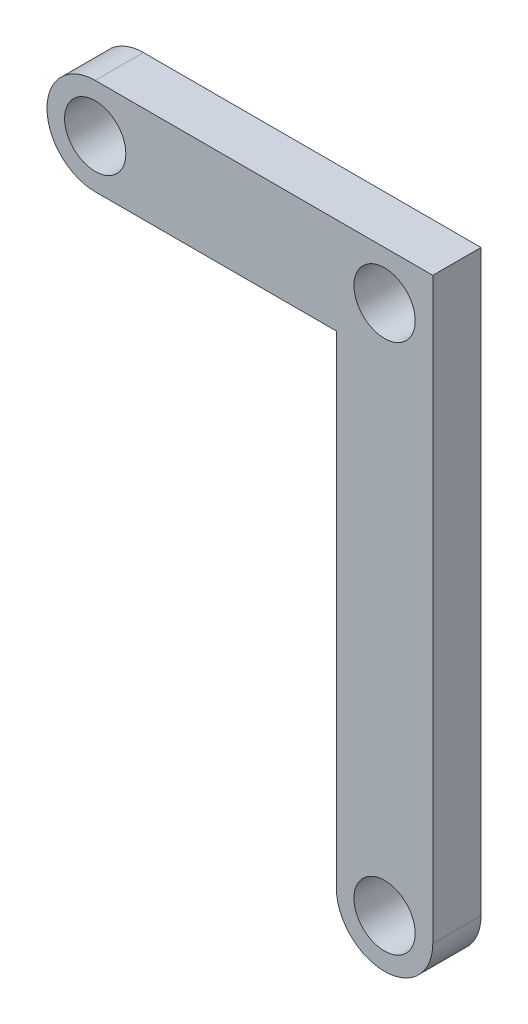
ISO-10303-21;
HEADER;
FILE_DESCRIPTION(('STEP AP214'),'2;1');
FILE_NAME('part.step','',(''),(''),'','','');
FILE_SCHEMA(('AUTOMOTIVE_DESIGN { 1 0 10303 214 1 1 1 1 }'));
ENDSEC;
DATA;
#1=APPLICATION_CONTEXT('core data for automotive mechanical design processes');
#2=APPLICATION_PROTOCOL_DEFINITION('international standard','automotive_design',2000,#1);
#3=PRODUCT_CONTEXT('',#1,'mechanical');
#4=PRODUCT('Part','Part','',(#3));
#5=PRODUCT_RELATED_PRODUCT_CATEGORY('part','',(#4));
#6=PRODUCT_DEFINITION_FORMATION('','',#4);
#7=PRODUCT_DEFINITION_CONTEXT('part definition',#1,'design');
#8=PRODUCT_DEFINITION('design','',#6,#7);
#9=PRODUCT_DEFINITION_SHAPE('','',#8);
#10=(LENGTH_UNIT() NAMED_UNIT(*) SI_UNIT(.MILLI.,.METRE.));
#11=(NAMED_UNIT(*) PLANE_ANGLE_UNIT() SI_UNIT($,.RADIAN.));
#12=(NAMED_UNIT(*) SI_UNIT($,.STERADIAN.) SOLID_ANGLE_UNIT());
#13=UNCERTAINTY_MEASURE_WITH_UNIT(LENGTH_MEASURE(1.E-05),#10,'distance_accuracy_value','');
#14=(GEOMETRIC_REPRESENTATION_CONTEXT(3) GLOBAL_UNCERTAINTY_ASSIGNED_CONTEXT((#13)) GLOBAL_UNIT_ASSIGNED_CONTEXT((#10,
#11,#12)) REPRESENTATION_CONTEXT('',''));
#15=CARTESIAN_POINT('',(0.,0.,0.));
#16=DIRECTION('',(0.,0.,1.));
#17=DIRECTION('',(1.,0.,0.));
#18=AXIS2_PLACEMENT_3D('',#15,#16,#17);
#19=CARTESIAN_POINT('',(-25.,5.,2.5));
#20=DIRECTION('',(0.,0.,-1.));
#21=DIRECTION('',(-1.,0.,0.));
#22=AXIS2_PLACEMENT_3D('',#19,#20,#21);
#23=PLANE('',#22);
#24=DIRECTION('',(1.,0.,0.));
#25=VECTOR('',#24,1.);
#26=CARTESIAN_POINT('',(0.,0.,2.5));
#27=LINE('',#26,#25);
#28=CARTESIAN_POINT('',(-25.,0.,2.5));
#29=VERTEX_POINT('',#28);
#30=CARTESIAN_POINT('',(0.,0.,2.5));
#31=VERTEX_POINT('',#30);
#32=EDGE_CURVE('E135',#29,#31,#27,.T.);
#33=ORIENTED_EDGE('',*,*,#32,.T.);
#34=DIRECTION('',(0.,-1.,0.));
#35=VECTOR('',#34,1.);
#36=CARTESIAN_POINT('',(0.,0.,2.5));
#37=LINE('',#36,#35);
#38=CARTESIAN_POINT('',(0.,-50.,2.5));
#39=VERTEX_POINT('',#38);
#40=EDGE_CURVE('E93',#31,#39,#37,.T.);
#41=ORIENTED_EDGE('',*,*,#40,.T.);
#42=CARTESIAN_POINT('',(5.00000000000001,-50.,2.5));
#43=DIRECTION('',(0.,0.,1.));
#44=DIRECTION('',(1.,0.,0.));
#45=AXIS2_PLACEMENT_3D('',#42,#43,#44);
#46=CIRCLE('',#45,5.);
#47=CARTESIAN_POINT('',(10.,-50.,2.5));
#48=VERTEX_POINT('',#47);
#49=EDGE_CURVE('E106',#39,#48,#46,.T.);
#50=ORIENTED_EDGE('',*,*,#49,.T.);
#51=DIRECTION('',(0.,1.,0.));
#52=VECTOR('',#51,1.);
#53=CARTESIAN_POINT('',(10.,10.,2.5));
#54=LINE('',#53,#52);
#55=CARTESIAN_POINT('',(10.,10.,2.5));
#56=VERTEX_POINT('',#55);
#57=EDGE_CURVE('E100',#48,#56,#54,.T.);
#58=ORIENTED_EDGE('',*,*,#57,.T.);
#59=DIRECTION('',(-1.,0.,0.));
#60=VECTOR('',#59,1.);
#61=CARTESIAN_POINT('',(10.,10.,2.5));
#62=LINE('',#61,#60);
#63=CARTESIAN_POINT('',(-25.,10.,2.5));
#64=VERTEX_POINT('',#63);
#65=EDGE_CURVE('E104',#56,#64,#62,.T.);
#66=ORIENTED_EDGE('',*,*,#65,.T.);
#67=CARTESIAN_POINT('',(-25.,5.,2.5));
#68=DIRECTION('',(0.,0.,1.));
#69=DIRECTION('',(-1.,0.,0.));
#70=AXIS2_PLACEMENT_3D('',#67,#68,#69);
#71=CIRCLE('',#70,5.);
#72=EDGE_CURVE('E56',#64,#29,#71,.T.);
#73=ORIENTED_EDGE('',*,*,#72,.T.);
#74=EDGE_LOOP('',(#33,#41,#50,#58,#66,#73));
#75=FACE_BOUND('',#74,.T.);
#76=CARTESIAN_POINT('',(5.00000000000001,-50.,2.5));
#77=DIRECTION('',(0.,0.,1.));
#78=DIRECTION('',(1.,0.,0.));
#79=AXIS2_PLACEMENT_3D('',#76,#77,#78);
#80=CIRCLE('',#79,3.175);
#81=CARTESIAN_POINT('',(8.17500000000001,-50.,2.5));
#82=VERTEX_POINT('',#81);
#83=EDGE_CURVE('E128',#82,#82,#80,.T.);
#84=ORIENTED_EDGE('',*,*,#83,.F.);
#85=EDGE_LOOP('',(#84));
#86=FACE_BOUND('',#85,.T.);
#87=CARTESIAN_POINT('',(5.,5.,2.5));
#88=DIRECTION('',(0.,0.,1.));
#89=DIRECTION('',(1.,0.,0.));
#90=AXIS2_PLACEMENT_3D('',#87,#88,#89);
#91=CIRCLE('',#90,3.175);
#92=CARTESIAN_POINT('',(8.17500000000001,5.,2.5));
#93=VERTEX_POINT('',#92);
#94=EDGE_CURVE('E189',#93,#93,#91,.T.);
#95=ORIENTED_EDGE('',*,*,#94,.F.);
#96=EDGE_LOOP('',(#95));
#97=FACE_BOUND('',#96,.T.);
#98=CARTESIAN_POINT('',(-25.,5.,2.5));
#99=DIRECTION('',(0.,0.,1.));
#100=DIRECTION('',(1.,0.,0.));
#101=AXIS2_PLACEMENT_3D('',#98,#99,#100);
#102=CIRCLE('',#101,3.175);
#103=CARTESIAN_POINT('',(-21.825,5.,2.5));
#104=VERTEX_POINT('',#103);
#105=EDGE_CURVE('E180',#104,#104,#102,.T.);
#106=ORIENTED_EDGE('',*,*,#105,.F.);
#107=EDGE_LOOP('',(#106));
#108=FACE_BOUND('',#107,.T.);
#109=ADVANCED_FACE('F39',(#75,#86,#97,#108),#23,.F.);
#110=CARTESIAN_POINT('',(-25.,5.,-2.5));
#111=DIRECTION('',(0.,0.,-1.));
#112=DIRECTION('',(-1.,0.,0.));
#113=AXIS2_PLACEMENT_3D('',#110,#111,#112);
#114=PLANE('',#113);
#115=CARTESIAN_POINT('',(5.,5.,-2.5));
#116=DIRECTION('',(0.,0.,1.));
#117=DIRECTION('',(1.,0.,0.));
#118=AXIS2_PLACEMENT_3D('',#115,#116,#117);
#119=CIRCLE('',#118,3.175);
#120=CARTESIAN_POINT('',(8.17500000000001,5.,-2.5));
#121=VERTEX_POINT('',#120);
#122=EDGE_CURVE('E186',#121,#121,#119,.T.);
#123=ORIENTED_EDGE('',*,*,#122,.T.);
#124=EDGE_LOOP('',(#123));
#125=FACE_BOUND('',#124,.T.);
#126=DIRECTION('',(1.,0.,0.));
#127=VECTOR('',#126,1.);
#128=CARTESIAN_POINT('',(0.,0.,-2.5));
#129=LINE('',#128,#127);
#130=CARTESIAN_POINT('',(-25.,0.,-2.5));
#131=VERTEX_POINT('',#130);
#132=CARTESIAN_POINT('',(0.,0.,-2.5));
#133=VERTEX_POINT('',#132);
#134=EDGE_CURVE('E124',#131,#133,#129,.T.);
#135=ORIENTED_EDGE('',*,*,#134,.F.);
#136=CARTESIAN_POINT('',(-25.,5.,-2.5));
#137=DIRECTION('',(0.,0.,1.));
#138=DIRECTION('',(-1.,0.,0.));
#139=AXIS2_PLACEMENT_3D('',#136,#137,#138);
#140=CIRCLE('',#139,5.);
#141=CARTESIAN_POINT('',(-25.,10.,-2.5));
#142=VERTEX_POINT('',#141);
#143=EDGE_CURVE('E85',#142,#131,#140,.T.);
#144=ORIENTED_EDGE('',*,*,#143,.F.);
#145=DIRECTION('',(-1.,0.,0.));
#146=VECTOR('',#145,1.);
#147=CARTESIAN_POINT('',(10.,10.,-2.5));
#148=LINE('',#147,#146);
#149=CARTESIAN_POINT('',(10.,10.,-2.5));
#150=VERTEX_POINT('',#149);
#151=EDGE_CURVE('E79',#150,#142,#148,.T.);
#152=ORIENTED_EDGE('',*,*,#151,.F.);
#153=DIRECTION('',(0.,1.,0.));
#154=VECTOR('',#153,1.);
#155=CARTESIAN_POINT('',(10.,10.,-2.5));
#156=LINE('',#155,#154);
#157=CARTESIAN_POINT('',(10.,-50.,-2.5));
#158=VERTEX_POINT('',#157);
#159=EDGE_CURVE('E114',#158,#150,#156,.T.);
#160=ORIENTED_EDGE('',*,*,#159,.F.);
#161=CARTESIAN_POINT('',(5.00000000000001,-50.,-2.5));
#162=DIRECTION('',(0.,0.,1.));
#163=DIRECTION('',(1.,0.,0.));
#164=AXIS2_PLACEMENT_3D('',#161,#162,#163);
#165=CIRCLE('',#164,5.);
#166=CARTESIAN_POINT('',(0.,-50.,-2.5));
#167=VERTEX_POINT('',#166);
#168=EDGE_CURVE('E130',#167,#158,#165,.T.);
#169=ORIENTED_EDGE('',*,*,#168,.F.);
#170=DIRECTION('',(0.,-1.,0.));
#171=VECTOR('',#170,1.);
#172=CARTESIAN_POINT('',(0.,0.,-2.5));
#173=LINE('',#172,#171);
#174=EDGE_CURVE('E127',#133,#167,#173,.T.);
#175=ORIENTED_EDGE('',*,*,#174,.F.);
#176=EDGE_LOOP('',(#135,#144,#152,#160,#169,#175));
#177=FACE_BOUND('',#176,.T.);
#178=CARTESIAN_POINT('',(5.00000000000001,-50.,-2.5));
#179=DIRECTION('',(0.,0.,1.));
#180=DIRECTION('',(1.,0.,0.));
#181=AXIS2_PLACEMENT_3D('',#178,#179,#180);
#182=CIRCLE('',#181,3.175);
#183=CARTESIAN_POINT('',(8.17500000000001,-50.,-2.5));
#184=VERTEX_POINT('',#183);
#185=EDGE_CURVE('E192',#184,#184,#182,.T.);
#186=ORIENTED_EDGE('',*,*,#185,.T.);
#187=EDGE_LOOP('',(#186));
#188=FACE_BOUND('',#187,.T.);
#189=CARTESIAN_POINT('',(-25.,5.,-2.5));
#190=DIRECTION('',(0.,0.,1.));
#191=DIRECTION('',(1.,0.,0.));
#192=AXIS2_PLACEMENT_3D('',#189,#190,#191);
#193=CIRCLE('',#192,3.175);
#194=CARTESIAN_POINT('',(-21.825,5.,-2.5));
#195=VERTEX_POINT('',#194);
#196=EDGE_CURVE('E183',#195,#195,#193,.T.);
#197=ORIENTED_EDGE('',*,*,#196,.T.);
#198=EDGE_LOOP('',(#197));
#199=FACE_BOUND('',#198,.T.);
#200=ADVANCED_FACE('F144',(#125,#177,#188,#199),#114,.T.);
#201=CARTESIAN_POINT('',(0.,0.,2.5));
#202=DIRECTION('',(0.,1.,0.));
#203=DIRECTION('',(-1.,0.,0.));
#204=AXIS2_PLACEMENT_3D('',#201,#202,#203);
#205=PLANE('',#204);
#206=ORIENTED_EDGE('',*,*,#134,.T.);
#207=DIRECTION('',(0.,0.,-1.));
#208=VECTOR('',#207,1.);
#209=CARTESIAN_POINT('',(0.,0.,2.5));
#210=LINE('',#209,#208);
#211=EDGE_CURVE('E11',#31,#133,#210,.T.);
#212=ORIENTED_EDGE('',*,*,#211,.F.);
#213=ORIENTED_EDGE('',*,*,#32,.F.);
#214=DIRECTION('',(0.,0.,-1.));
#215=VECTOR('',#214,1.);
#216=CARTESIAN_POINT('',(-25.,0.,2.5));
#217=LINE('',#216,#215);
#218=EDGE_CURVE('E120',#29,#131,#217,.T.);
#219=ORIENTED_EDGE('',*,*,#218,.T.);
#220=EDGE_LOOP('',(#206,#212,#213,#219));
#221=FACE_BOUND('',#220,.T.);
#222=ADVANCED_FACE('F41',(#221),#205,.F.);
#223=CARTESIAN_POINT('',(0.,0.,2.5));
#224=DIRECTION('',(1.,0.,0.));
#225=DIRECTION('',(0.,1.,0.));
#226=AXIS2_PLACEMENT_3D('',#223,#224,#225);
#227=PLANE('',#226);
#228=ORIENTED_EDGE('',*,*,#174,.T.);
#229=DIRECTION('',(0.,0.,-1.));
#230=VECTOR('',#229,1.);
#231=CARTESIAN_POINT('',(0.,-50.,2.5));
#232=LINE('',#231,#230);
#233=EDGE_CURVE('E48',#39,#167,#232,.T.);
#234=ORIENTED_EDGE('',*,*,#233,.F.);
#235=ORIENTED_EDGE('',*,*,#40,.F.);
#236=ORIENTED_EDGE('',*,*,#211,.T.);
#237=EDGE_LOOP('',(#228,#234,#235,#236));
#238=FACE_BOUND('',#237,.T.);
#239=ADVANCED_FACE('F247',(#238),#227,.F.);
#240=CARTESIAN_POINT('',(5.00000000000001,-50.,2.5));
#241=DIRECTION('',(0.,0.,-1.));
#242=DIRECTION('',(-1.,0.,0.));
#243=AXIS2_PLACEMENT_3D('',#240,#241,#242);
#244=CYLINDRICAL_SURFACE('',#243,5.);
#245=ORIENTED_EDGE('',*,*,#168,.T.);
#246=DIRECTION('',(0.,0.,-1.));
#247=VECTOR('',#246,1.);
#248=CARTESIAN_POINT('',(10.,-50.,2.5));
#249=LINE('',#248,#247);
#250=EDGE_CURVE('E115',#48,#158,#249,.T.);
#251=ORIENTED_EDGE('',*,*,#250,.F.);
#252=ORIENTED_EDGE('',*,*,#49,.F.);
#253=ORIENTED_EDGE('',*,*,#233,.T.);
#254=EDGE_LOOP('',(#245,#251,#252,#253));
#255=FACE_BOUND('',#254,.T.);
#256=ADVANCED_FACE('F141',(#255),#244,.T.);
#257=CARTESIAN_POINT('',(10.,10.,2.5));
#258=DIRECTION('',(-1.,0.,0.));
#259=DIRECTION('',(0.,-1.,0.));
#260=AXIS2_PLACEMENT_3D('',#257,#258,#259);
#261=PLANE('',#260);
#262=ORIENTED_EDGE('',*,*,#159,.T.);
#263=DIRECTION('',(0.,0.,-1.));
#264=VECTOR('',#263,1.);
#265=CARTESIAN_POINT('',(10.,10.,2.5));
#266=LINE('',#265,#264);
#267=EDGE_CURVE('E111',#56,#150,#266,.T.);
#268=ORIENTED_EDGE('',*,*,#267,.F.);
#269=ORIENTED_EDGE('',*,*,#57,.F.);
#270=ORIENTED_EDGE('',*,*,#250,.T.);
#271=EDGE_LOOP('',(#262,#268,#269,#270));
#272=FACE_BOUND('',#271,.T.);
#273=ADVANCED_FACE('F112',(#272),#261,.F.);
#274=CARTESIAN_POINT('',(10.,10.,2.5));
#275=DIRECTION('',(0.,-1.,0.));
#276=DIRECTION('',(1.,0.,0.));
#277=AXIS2_PLACEMENT_3D('',#274,#275,#276);
#278=PLANE('',#277);
#279=ORIENTED_EDGE('',*,*,#151,.T.);
#280=DIRECTION('',(0.,0.,-1.));
#281=VECTOR('',#280,1.);
#282=CARTESIAN_POINT('',(-25.,10.,2.5));
#283=LINE('',#282,#281);
#284=EDGE_CURVE('E116',#64,#142,#283,.T.);
#285=ORIENTED_EDGE('',*,*,#284,.F.);
#286=ORIENTED_EDGE('',*,*,#65,.F.);
#287=ORIENTED_EDGE('',*,*,#267,.T.);
#288=EDGE_LOOP('',(#279,#285,#286,#287));
#289=FACE_BOUND('',#288,.T.);
#290=ADVANCED_FACE('F118',(#289),#278,.F.);
#291=CARTESIAN_POINT('',(-25.,5.,2.5));
#292=DIRECTION('',(0.,0.,-1.));
#293=DIRECTION('',(-1.,0.,0.));
#294=AXIS2_PLACEMENT_3D('',#291,#292,#293);
#295=CYLINDRICAL_SURFACE('',#294,5.);
#296=ORIENTED_EDGE('',*,*,#143,.T.);
#297=ORIENTED_EDGE('',*,*,#218,.F.);
#298=ORIENTED_EDGE('',*,*,#72,.F.);
#299=ORIENTED_EDGE('',*,*,#284,.T.);
#300=EDGE_LOOP('',(#296,#297,#298,#299));
#301=FACE_BOUND('',#300,.T.);
#302=ADVANCED_FACE('F149',(#301),#295,.T.);
#303=CARTESIAN_POINT('',(5.00000000000001,-50.,2.5));
#304=DIRECTION('',(0.,0.,-1.));
#305=DIRECTION('',(-1.,0.,0.));
#306=AXIS2_PLACEMENT_3D('',#303,#304,#305);
#307=CYLINDRICAL_SURFACE('',#306,3.175);
#308=ORIENTED_EDGE('',*,*,#83,.T.);
#309=EDGE_LOOP('',(#308));
#310=FACE_BOUND('',#309,.T.);
#311=ORIENTED_EDGE('',*,*,#185,.F.);
#312=EDGE_LOOP('',(#311));
#313=FACE_BOUND('',#312,.T.);
#314=ADVANCED_FACE('F151',(#310,#313),#307,.F.);
#315=CARTESIAN_POINT('',(5.,5.,2.5));
#316=DIRECTION('',(0.,0.,-1.));
#317=DIRECTION('',(-1.,0.,0.));
#318=AXIS2_PLACEMENT_3D('',#315,#316,#317);
#319=CYLINDRICAL_SURFACE('',#318,3.175);
#320=ORIENTED_EDGE('',*,*,#94,.T.);
#321=EDGE_LOOP('',(#320));
#322=FACE_BOUND('',#321,.T.);
#323=ORIENTED_EDGE('',*,*,#122,.F.);
#324=EDGE_LOOP('',(#323));
#325=FACE_BOUND('',#324,.T.);
#326=ADVANCED_FACE('F157',(#322,#325),#319,.F.);
#327=CARTESIAN_POINT('',(-25.,5.,2.5));
#328=DIRECTION('',(0.,0.,-1.));
#329=DIRECTION('',(-1.,0.,0.));
#330=AXIS2_PLACEMENT_3D('',#327,#328,#329);
#331=CYLINDRICAL_SURFACE('',#330,3.175);
#332=ORIENTED_EDGE('',*,*,#105,.T.);
#333=EDGE_LOOP('',(#332));
#334=FACE_BOUND('',#333,.T.);
#335=ORIENTED_EDGE('',*,*,#196,.F.);
#336=EDGE_LOOP('',(#335));
#337=FACE_BOUND('',#336,.T.);
#338=ADVANCED_FACE('F171',(#334,#337),#331,.F.);
#339=CLOSED_SHELL('',(#109,#200,#222,#239,#256,#273,#290,#302,#314,#326,#338));
#340=MANIFOLD_SOLID_BREP('B2',#339);
#341=ADVANCED_BREP_SHAPE_REPRESENTATION('',(#18,#340),#14);
#342=SHAPE_DEFINITION_REPRESENTATION(#9,#341);
ENDSEC;
END-ISO-10303-21;
